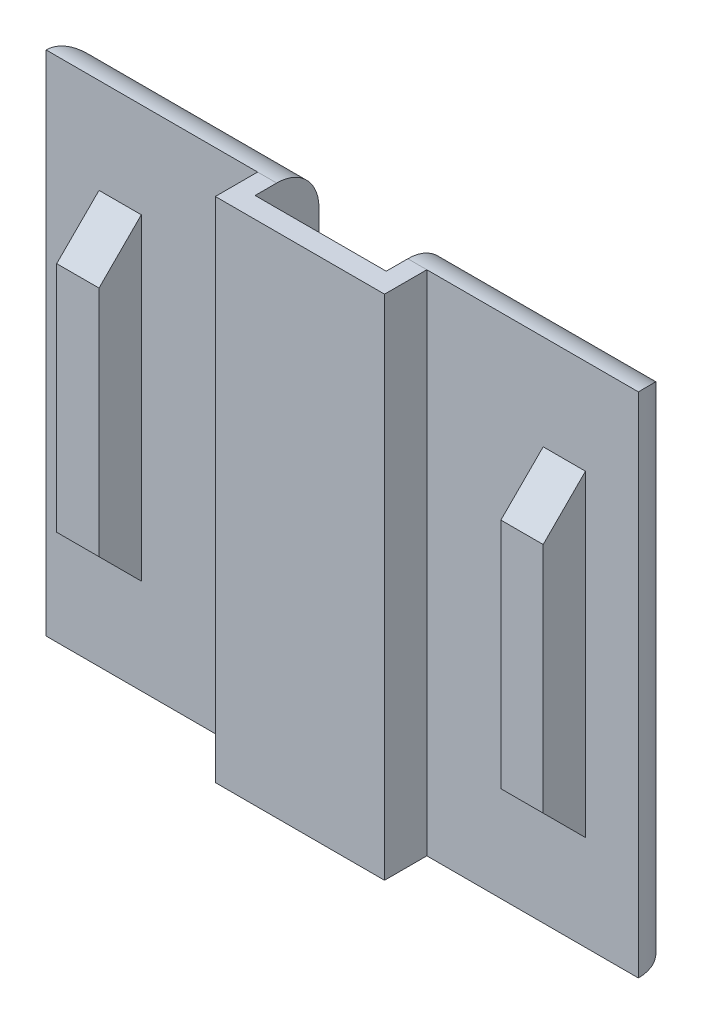
ISO-10303-21;
HEADER;
FILE_DESCRIPTION(('STEP AP214'),'2;1');
FILE_NAME('part.step','',(''),(''),'','','');
FILE_SCHEMA(('AUTOMOTIVE_DESIGN { 1 0 10303 214 1 1 1 1 }'));
ENDSEC;
DATA;
#1=APPLICATION_CONTEXT('core data for automotive mechanical design processes');
#2=APPLICATION_PROTOCOL_DEFINITION('international standard','automotive_design',2000,#1);
#3=PRODUCT_CONTEXT('',#1,'mechanical');
#4=PRODUCT('Part','Part','',(#3));
#5=PRODUCT_RELATED_PRODUCT_CATEGORY('part','',(#4));
#6=PRODUCT_DEFINITION_FORMATION('','',#4);
#7=PRODUCT_DEFINITION_CONTEXT('part definition',#1,'design');
#8=PRODUCT_DEFINITION('design','',#6,#7);
#9=PRODUCT_DEFINITION_SHAPE('','',#8);
#10=(LENGTH_UNIT() NAMED_UNIT(*) SI_UNIT(.MILLI.,.METRE.));
#11=(NAMED_UNIT(*) PLANE_ANGLE_UNIT() SI_UNIT($,.RADIAN.));
#12=(NAMED_UNIT(*) SI_UNIT($,.STERADIAN.) SOLID_ANGLE_UNIT());
#13=UNCERTAINTY_MEASURE_WITH_UNIT(LENGTH_MEASURE(1.E-05),#10,'distance_accuracy_value','');
#14=(GEOMETRIC_REPRESENTATION_CONTEXT(3) GLOBAL_UNCERTAINTY_ASSIGNED_CONTEXT((#13)) GLOBAL_UNIT_ASSIGNED_CONTEXT((#10,
#11,#12)) REPRESENTATION_CONTEXT('',''));
#15=CARTESIAN_POINT('',(0.,0.,0.));
#16=DIRECTION('',(0.,0.,1.));
#17=DIRECTION('',(1.,0.,0.));
#18=AXIS2_PLACEMENT_3D('',#15,#16,#17);
#19=CARTESIAN_POINT('',(0.,0.,1.));
#20=DIRECTION('',(0.,0.,1.));
#21=DIRECTION('',(1.,0.,0.));
#22=AXIS2_PLACEMENT_3D('',#19,#20,#21);
#23=PLANE('',#22);
#24=DIRECTION('',(0.,-1.,0.));
#25=VECTOR('',#24,1.);
#26=CARTESIAN_POINT('',(-5.75,4.75,1.));
#27=LINE('',#26,#25);
#28=CARTESIAN_POINT('',(-5.75,3.75,1.));
#29=VERTEX_POINT('',#28);
#30=CARTESIAN_POINT('',(-5.75,-3.75,1.));
#31=VERTEX_POINT('',#30);
#32=EDGE_CURVE('E296',#29,#31,#27,.T.);
#33=ORIENTED_EDGE('',*,*,#32,.F.);
#34=DIRECTION('',(-1.,0.,0.));
#35=VECTOR('',#34,1.);
#36=CARTESIAN_POINT('',(-5.75,3.75,1.));
#37=LINE('',#36,#35);
#38=CARTESIAN_POINT('',(-4.75,3.75,1.));
#39=VERTEX_POINT('',#38);
#40=EDGE_CURVE('E198',#39,#29,#37,.T.);
#41=ORIENTED_EDGE('',*,*,#40,.F.);
#42=DIRECTION('',(0.,1.,0.));
#43=VECTOR('',#42,1.);
#44=CARTESIAN_POINT('',(-4.75,4.75,1.));
#45=LINE('',#44,#43);
#46=CARTESIAN_POINT('',(-4.75,-3.75,1.));
#47=VERTEX_POINT('',#46);
#48=EDGE_CURVE('E332',#47,#39,#45,.T.);
#49=ORIENTED_EDGE('',*,*,#48,.F.);
#50=DIRECTION('',(1.,0.,0.));
#51=VECTOR('',#50,1.);
#52=CARTESIAN_POINT('',(-5.75,-3.75,1.));
#53=LINE('',#52,#51);
#54=EDGE_CURVE('E300',#31,#47,#53,.T.);
#55=ORIENTED_EDGE('',*,*,#54,.F.);
#56=EDGE_LOOP('',(#33,#41,#49,#55));
#57=FACE_BOUND('',#56,.T.);
#58=DIRECTION('',(0.,-1.,0.));
#59=VECTOR('',#58,1.);
#60=CARTESIAN_POINT('',(-2.,-6.,1.));
#61=LINE('',#60,#59);
#62=CARTESIAN_POINT('',(-2.,6.,1.));
#63=VERTEX_POINT('',#62);
#64=CARTESIAN_POINT('',(-2.,-6.,1.));
#65=VERTEX_POINT('',#64);
#66=EDGE_CURVE('E239',#63,#65,#61,.T.);
#67=ORIENTED_EDGE('',*,*,#66,.F.);
#68=DIRECTION('',(-1.,0.,0.));
#69=VECTOR('',#68,1.);
#70=CARTESIAN_POINT('',(7.,6.,1.));
#71=LINE('',#70,#69);
#72=CARTESIAN_POINT('',(-7.,6.,1.));
#73=VERTEX_POINT('',#72);
#74=EDGE_CURVE('E607',#63,#73,#71,.T.);
#75=ORIENTED_EDGE('',*,*,#74,.T.);
#76=DIRECTION('',(0.,-1.,0.));
#77=VECTOR('',#76,1.);
#78=CARTESIAN_POINT('',(-7.,-6.,1.));
#79=LINE('',#78,#77);
#80=CARTESIAN_POINT('',(-7.,-6.,1.));
#81=VERTEX_POINT('',#80);
#82=EDGE_CURVE('E617',#73,#81,#79,.T.);
#83=ORIENTED_EDGE('',*,*,#82,.T.);
#84=DIRECTION('',(1.,0.,0.));
#85=VECTOR('',#84,1.);
#86=CARTESIAN_POINT('',(7.,-6.,1.));
#87=LINE('',#86,#85);
#88=EDGE_CURVE('E618',#81,#65,#87,.T.);
#89=ORIENTED_EDGE('',*,*,#88,.T.);
#90=EDGE_LOOP('',(#67,#75,#83,#89));
#91=FACE_BOUND('',#90,.T.);
#92=ADVANCED_FACE('F33',(#57,#91),#23,.T.);
#93=DIRECTION('',(-1.,0.,0.));
#94=VECTOR('',#93,1.);
#95=CARTESIAN_POINT('',(4.75,3.75,1.));
#96=LINE('',#95,#94);
#97=CARTESIAN_POINT('',(5.75,3.75,1.));
#98=VERTEX_POINT('',#97);
#99=CARTESIAN_POINT('',(4.75,3.75,1.));
#100=VERTEX_POINT('',#99);
#101=EDGE_CURVE('E179',#98,#100,#96,.T.);
#102=ORIENTED_EDGE('',*,*,#101,.F.);
#103=DIRECTION('',(0.,1.,0.));
#104=VECTOR('',#103,1.);
#105=CARTESIAN_POINT('',(5.75,-4.75,1.));
#106=LINE('',#105,#104);
#107=CARTESIAN_POINT('',(5.75,-3.75,1.));
#108=VERTEX_POINT('',#107);
#109=EDGE_CURVE('E194',#108,#98,#106,.T.);
#110=ORIENTED_EDGE('',*,*,#109,.F.);
#111=DIRECTION('',(1.,0.,0.));
#112=VECTOR('',#111,1.);
#113=CARTESIAN_POINT('',(4.75,-3.75,1.));
#114=LINE('',#113,#112);
#115=CARTESIAN_POINT('',(4.75,-3.75,1.));
#116=VERTEX_POINT('',#115);
#117=EDGE_CURVE('E327',#116,#108,#114,.T.);
#118=ORIENTED_EDGE('',*,*,#117,.F.);
#119=DIRECTION('',(0.,-1.,0.));
#120=VECTOR('',#119,1.);
#121=CARTESIAN_POINT('',(4.75,-4.75,1.));
#122=LINE('',#121,#120);
#123=EDGE_CURVE('E197',#100,#116,#122,.T.);
#124=ORIENTED_EDGE('',*,*,#123,.F.);
#125=EDGE_LOOP('',(#102,#110,#118,#124));
#126=FACE_BOUND('',#125,.T.);
#127=DIRECTION('',(0.,1.,0.));
#128=VECTOR('',#127,1.);
#129=CARTESIAN_POINT('',(2.,-6.,1.));
#130=LINE('',#129,#128);
#131=CARTESIAN_POINT('',(2.,-6.,1.));
#132=VERTEX_POINT('',#131);
#133=CARTESIAN_POINT('',(2.,6.,1.));
#134=VERTEX_POINT('',#133);
#135=EDGE_CURVE('E234',#132,#134,#130,.T.);
#136=ORIENTED_EDGE('',*,*,#135,.F.);
#137=CARTESIAN_POINT('',(7.,-6.,1.));
#138=VERTEX_POINT('',#137);
#139=EDGE_CURVE('E619',#132,#138,#87,.T.);
#140=ORIENTED_EDGE('',*,*,#139,.T.);
#141=DIRECTION('',(0.,1.,0.));
#142=VECTOR('',#141,1.);
#143=CARTESIAN_POINT('',(7.,-6.,1.));
#144=LINE('',#143,#142);
#145=CARTESIAN_POINT('',(7.,6.,1.));
#146=VERTEX_POINT('',#145);
#147=EDGE_CURVE('E610',#138,#146,#144,.T.);
#148=ORIENTED_EDGE('',*,*,#147,.T.);
#149=EDGE_CURVE('E265',#146,#134,#71,.T.);
#150=ORIENTED_EDGE('',*,*,#149,.T.);
#151=EDGE_LOOP('',(#136,#140,#148,#150));
#152=FACE_BOUND('',#151,.T.);
#153=ADVANCED_FACE('F191',(#126,#152),#23,.T.);
#154=CARTESIAN_POINT('',(0.,0.,0.));
#155=DIRECTION('',(0.,0.,1.));
#156=DIRECTION('',(1.,0.,0.));
#157=AXIS2_PLACEMENT_3D('',#154,#155,#156);
#158=PLANE('',#157);
#159=DIRECTION('',(0.,-1.,0.));
#160=VECTOR('',#159,1.);
#161=CARTESIAN_POINT('',(-6.,0.,0.));
#162=LINE('',#161,#160);
#163=CARTESIAN_POINT('',(-6.,-6.,0.));
#164=VERTEX_POINT('',#163);
#165=CARTESIAN_POINT('',(-6.,5.,0.));
#166=VERTEX_POINT('',#165);
#167=EDGE_CURVE('E275',#164,#166,#162,.F.);
#168=ORIENTED_EDGE('',*,*,#167,.T.);
#169=DIRECTION('',(-1.,0.,0.));
#170=VECTOR('',#169,1.);
#171=CARTESIAN_POINT('',(0.,5.,0.));
#172=LINE('',#171,#170);
#173=CARTESIAN_POINT('',(-1.55,5.,0.));
#174=VERTEX_POINT('',#173);
#175=EDGE_CURVE('E279',#166,#174,#172,.F.);
#176=ORIENTED_EDGE('',*,*,#175,.T.);
#177=DIRECTION('',(0.,-1.,0.));
#178=VECTOR('',#177,1.);
#179=CARTESIAN_POINT('',(-1.55,0.,0.));
#180=LINE('',#179,#178);
#181=CARTESIAN_POINT('',(-1.55,-6.,0.));
#182=VERTEX_POINT('',#181);
#183=EDGE_CURVE('E264',#174,#182,#180,.T.);
#184=ORIENTED_EDGE('',*,*,#183,.T.);
#185=DIRECTION('',(1.,0.,0.));
#186=VECTOR('',#185,1.);
#187=CARTESIAN_POINT('',(7.,-6.,0.));
#188=LINE('',#187,#186);
#189=EDGE_CURVE('E594',#164,#182,#188,.T.);
#190=ORIENTED_EDGE('',*,*,#189,.F.);
#191=EDGE_LOOP('',(#168,#176,#184,#190));
#192=FACE_BOUND('',#191,.T.);
#193=ADVANCED_FACE('F359',(#192),#158,.F.);
#194=CARTESIAN_POINT('',(7.,-6.,1.));
#195=DIRECTION('',(0.,1.,0.));
#196=DIRECTION('',(-1.,0.,0.));
#197=AXIS2_PLACEMENT_3D('',#194,#195,#196);
#198=PLANE('',#197);
#199=CARTESIAN_POINT('',(1.55,-6.,0.));
#200=VERTEX_POINT('',#199);
#201=CARTESIAN_POINT('',(6.,-6.,0.));
#202=VERTEX_POINT('',#201);
#203=EDGE_CURVE('E591',#200,#202,#188,.T.);
#204=ORIENTED_EDGE('',*,*,#203,.T.);
#205=CARTESIAN_POINT('',(6.,-6.,1.));
#206=DIRECTION('',(0.,1.,0.));
#207=DIRECTION('',(-1.,0.,0.));
#208=AXIS2_PLACEMENT_3D('',#205,#206,#207);
#209=CIRCLE('',#208,1.);
#210=EDGE_CURVE('E291',#202,#138,#209,.F.);
#211=ORIENTED_EDGE('',*,*,#210,.T.);
#212=ORIENTED_EDGE('',*,*,#139,.F.);
#213=DIRECTION('',(0.,0.,-1.));
#214=VECTOR('',#213,1.);
#215=CARTESIAN_POINT('',(2.,-6.,2.));
#216=LINE('',#215,#214);
#217=CARTESIAN_POINT('',(2.,-6.,2.));
#218=VERTEX_POINT('',#217);
#219=EDGE_CURVE('E245',#218,#132,#216,.T.);
#220=ORIENTED_EDGE('',*,*,#219,.F.);
#221=DIRECTION('',(1.,0.,0.));
#222=VECTOR('',#221,1.);
#223=CARTESIAN_POINT('',(-2.,-6.,2.));
#224=LINE('',#223,#222);
#225=CARTESIAN_POINT('',(-2.,-6.,2.));
#226=VERTEX_POINT('',#225);
#227=EDGE_CURVE('E243',#226,#218,#224,.T.);
#228=ORIENTED_EDGE('',*,*,#227,.F.);
#229=DIRECTION('',(0.,0.,-1.));
#230=VECTOR('',#229,1.);
#231=CARTESIAN_POINT('',(-2.,-6.,2.));
#232=LINE('',#231,#230);
#233=EDGE_CURVE('E258',#226,#65,#232,.T.);
#234=ORIENTED_EDGE('',*,*,#233,.T.);
#235=ORIENTED_EDGE('',*,*,#88,.F.);
#236=CARTESIAN_POINT('',(-6.,-6.,1.));
#237=DIRECTION('',(0.,1.,0.));
#238=DIRECTION('',(-1.,0.,0.));
#239=AXIS2_PLACEMENT_3D('',#236,#237,#238);
#240=CIRCLE('',#239,1.);
#241=EDGE_CURVE('E289',#81,#164,#240,.F.);
#242=ORIENTED_EDGE('',*,*,#241,.T.);
#243=ORIENTED_EDGE('',*,*,#189,.T.);
#244=DIRECTION('',(0.,0.,1.));
#245=VECTOR('',#244,1.);
#246=CARTESIAN_POINT('',(-1.55,-6.,1.));
#247=LINE('',#246,#245);
#248=CARTESIAN_POINT('',(-1.55,-6.,1.51));
#249=VERTEX_POINT('',#248);
#250=EDGE_CURVE('E228',#182,#249,#247,.T.);
#251=ORIENTED_EDGE('',*,*,#250,.T.);
#252=DIRECTION('',(1.,0.,0.));
#253=VECTOR('',#252,1.);
#254=CARTESIAN_POINT('',(7.,-6.,1.51));
#255=LINE('',#254,#253);
#256=CARTESIAN_POINT('',(1.55,-6.,1.51));
#257=VERTEX_POINT('',#256);
#258=EDGE_CURVE('E231',#249,#257,#255,.T.);
#259=ORIENTED_EDGE('',*,*,#258,.T.);
#260=DIRECTION('',(0.,0.,-1.));
#261=VECTOR('',#260,1.);
#262=CARTESIAN_POINT('',(1.55,-6.,1.));
#263=LINE('',#262,#261);
#264=EDGE_CURVE('E223',#257,#200,#263,.T.);
#265=ORIENTED_EDGE('',*,*,#264,.T.);
#266=EDGE_LOOP('',(#204,#211,#212,#220,#228,#234,#235,#242,#243,#251,#259,#265));
#267=FACE_BOUND('',#266,.T.);
#268=ADVANCED_FACE('F372',(#267),#198,.F.);
#269=CARTESIAN_POINT('',(7.,6.,1.));
#270=DIRECTION('',(0.,-1.,0.));
#271=DIRECTION('',(1.,0.,0.));
#272=AXIS2_PLACEMENT_3D('',#269,#270,#271);
#273=PLANE('',#272);
#274=DIRECTION('',(0.,0.,1.));
#275=VECTOR('',#274,1.);
#276=CARTESIAN_POINT('',(-1.55,6.,0.));
#277=LINE('',#276,#275);
#278=CARTESIAN_POINT('',(-1.55,6.,1.));
#279=VERTEX_POINT('',#278);
#280=CARTESIAN_POINT('',(-1.55,6.,1.51));
#281=VERTEX_POINT('',#280);
#282=EDGE_CURVE('E212',#279,#281,#277,.T.);
#283=ORIENTED_EDGE('',*,*,#282,.F.);
#284=DIRECTION('',(-1.,0.,0.));
#285=VECTOR('',#284,1.);
#286=CARTESIAN_POINT('',(7.,6.,1.));
#287=LINE('',#286,#285);
#288=EDGE_CURVE('E270',#279,#63,#287,.T.);
#289=ORIENTED_EDGE('',*,*,#288,.T.);
#290=DIRECTION('',(0.,0.,-1.));
#291=VECTOR('',#290,1.);
#292=CARTESIAN_POINT('',(-2.,6.,2.));
#293=LINE('',#292,#291);
#294=CARTESIAN_POINT('',(-2.,6.,2.));
#295=VERTEX_POINT('',#294);
#296=EDGE_CURVE('E592',#295,#63,#293,.T.);
#297=ORIENTED_EDGE('',*,*,#296,.F.);
#298=DIRECTION('',(-1.,0.,0.));
#299=VECTOR('',#298,1.);
#300=CARTESIAN_POINT('',(-2.,6.,2.));
#301=LINE('',#300,#299);
#302=CARTESIAN_POINT('',(2.,6.,2.));
#303=VERTEX_POINT('',#302);
#304=EDGE_CURVE('E238',#303,#295,#301,.T.);
#305=ORIENTED_EDGE('',*,*,#304,.F.);
#306=DIRECTION('',(0.,0.,-1.));
#307=VECTOR('',#306,1.);
#308=CARTESIAN_POINT('',(2.,6.,2.));
#309=LINE('',#308,#307);
#310=EDGE_CURVE('E590',#303,#134,#309,.T.);
#311=ORIENTED_EDGE('',*,*,#310,.T.);
#312=DIRECTION('',(-1.,0.,0.));
#313=VECTOR('',#312,1.);
#314=CARTESIAN_POINT('',(7.,6.,1.));
#315=LINE('',#314,#313);
#316=CARTESIAN_POINT('',(1.55,6.,1.));
#317=VERTEX_POINT('',#316);
#318=EDGE_CURVE('E268',#134,#317,#315,.T.);
#319=ORIENTED_EDGE('',*,*,#318,.T.);
#320=DIRECTION('',(0.,0.,-1.));
#321=VECTOR('',#320,1.);
#322=CARTESIAN_POINT('',(1.55,6.,0.));
#323=LINE('',#322,#321);
#324=CARTESIAN_POINT('',(1.55,6.,1.51));
#325=VERTEX_POINT('',#324);
#326=EDGE_CURVE('E217',#325,#317,#323,.T.);
#327=ORIENTED_EDGE('',*,*,#326,.F.);
#328=DIRECTION('',(1.,0.,0.));
#329=VECTOR('',#328,1.);
#330=CARTESIAN_POINT('',(-1.55,6.,1.51));
#331=LINE('',#330,#329);
#332=EDGE_CURVE('E214',#281,#325,#331,.T.);
#333=ORIENTED_EDGE('',*,*,#332,.F.);
#334=EDGE_LOOP('',(#283,#289,#297,#305,#311,#319,#327,#333));
#335=FACE_BOUND('',#334,.T.);
#336=ADVANCED_FACE('F368',(#335),#273,.F.);
#337=DIRECTION('',(0.,1.,0.));
#338=VECTOR('',#337,1.);
#339=CARTESIAN_POINT('',(1.55,0.,0.));
#340=LINE('',#339,#338);
#341=CARTESIAN_POINT('',(1.55,5.,0.));
#342=VERTEX_POINT('',#341);
#343=EDGE_CURVE('E261',#200,#342,#340,.T.);
#344=ORIENTED_EDGE('',*,*,#343,.T.);
#345=DIRECTION('',(-1.,0.,0.));
#346=VECTOR('',#345,1.);
#347=CARTESIAN_POINT('',(0.,5.,0.));
#348=LINE('',#347,#346);
#349=CARTESIAN_POINT('',(6.,5.,0.));
#350=VERTEX_POINT('',#349);
#351=EDGE_CURVE('E287',#342,#350,#348,.F.);
#352=ORIENTED_EDGE('',*,*,#351,.T.);
#353=DIRECTION('',(0.,1.,0.));
#354=VECTOR('',#353,1.);
#355=CARTESIAN_POINT('',(6.,0.,0.));
#356=LINE('',#355,#354);
#357=EDGE_CURVE('E285',#350,#202,#356,.F.);
#358=ORIENTED_EDGE('',*,*,#357,.T.);
#359=ORIENTED_EDGE('',*,*,#203,.F.);
#360=EDGE_LOOP('',(#344,#352,#358,#359));
#361=FACE_BOUND('',#360,.T.);
#362=ADVANCED_FACE('F365',(#361),#158,.F.);
#363=CARTESIAN_POINT('',(2.,-6.,2.));
#364=DIRECTION('',(-1.,0.,0.));
#365=DIRECTION('',(0.,0.,1.));
#366=AXIS2_PLACEMENT_3D('',#363,#364,#365);
#367=PLANE('',#366);
#368=ORIENTED_EDGE('',*,*,#135,.T.);
#369=ORIENTED_EDGE('',*,*,#310,.F.);
#370=DIRECTION('',(0.,1.,0.));
#371=VECTOR('',#370,1.);
#372=CARTESIAN_POINT('',(2.,-6.,2.));
#373=LINE('',#372,#371);
#374=EDGE_CURVE('E235',#218,#303,#373,.T.);
#375=ORIENTED_EDGE('',*,*,#374,.F.);
#376=ORIENTED_EDGE('',*,*,#219,.T.);
#377=EDGE_LOOP('',(#368,#369,#375,#376));
#378=FACE_BOUND('',#377,.T.);
#379=ADVANCED_FACE('F363',(#378),#367,.F.);
#380=CARTESIAN_POINT('',(-2.,-6.,2.));
#381=DIRECTION('',(1.,0.,0.));
#382=DIRECTION('',(0.,0.,-1.));
#383=AXIS2_PLACEMENT_3D('',#380,#381,#382);
#384=PLANE('',#383);
#385=ORIENTED_EDGE('',*,*,#66,.T.);
#386=ORIENTED_EDGE('',*,*,#233,.F.);
#387=DIRECTION('',(0.,-1.,0.));
#388=VECTOR('',#387,1.);
#389=CARTESIAN_POINT('',(-2.,-6.,2.));
#390=LINE('',#389,#388);
#391=EDGE_CURVE('E241',#295,#226,#390,.T.);
#392=ORIENTED_EDGE('',*,*,#391,.F.);
#393=ORIENTED_EDGE('',*,*,#296,.T.);
#394=EDGE_LOOP('',(#385,#386,#392,#393));
#395=FACE_BOUND('',#394,.T.);
#396=ADVANCED_FACE('F524',(#395),#384,.F.);
#397=CARTESIAN_POINT('',(0.,0.,2.));
#398=DIRECTION('',(0.,0.,-1.));
#399=DIRECTION('',(-1.,0.,0.));
#400=AXIS2_PLACEMENT_3D('',#397,#398,#399);
#401=PLANE('',#400);
#402=ORIENTED_EDGE('',*,*,#374,.T.);
#403=ORIENTED_EDGE('',*,*,#304,.T.);
#404=ORIENTED_EDGE('',*,*,#391,.T.);
#405=ORIENTED_EDGE('',*,*,#227,.T.);
#406=EDGE_LOOP('',(#402,#403,#404,#405));
#407=FACE_BOUND('',#406,.T.);
#408=ADVANCED_FACE('F529',(#407),#401,.F.);
#409=CARTESIAN_POINT('',(-1.55,-6.00005,1.51));
#410=DIRECTION('',(0.,0.,1.));
#411=DIRECTION('',(1.,0.,0.));
#412=AXIS2_PLACEMENT_3D('',#409,#410,#411);
#413=PLANE('',#412);
#414=DIRECTION('',(0.,1.,0.));
#415=VECTOR('',#414,1.);
#416=CARTESIAN_POINT('',(-1.55,-6.00005,1.51));
#417=LINE('',#416,#415);
#418=EDGE_CURVE('E220',#249,#281,#417,.T.);
#419=ORIENTED_EDGE('',*,*,#418,.T.);
#420=ORIENTED_EDGE('',*,*,#332,.T.);
#421=DIRECTION('',(0.,1.,0.));
#422=VECTOR('',#421,1.);
#423=CARTESIAN_POINT('',(1.55,-6.00005,1.51));
#424=LINE('',#423,#422);
#425=EDGE_CURVE('E221',#257,#325,#424,.T.);
#426=ORIENTED_EDGE('',*,*,#425,.F.);
#427=ORIENTED_EDGE('',*,*,#258,.F.);
#428=EDGE_LOOP('',(#419,#420,#426,#427));
#429=FACE_BOUND('',#428,.T.);
#430=ADVANCED_FACE('F516',(#429),#413,.F.);
#431=CARTESIAN_POINT('',(-1.55,-6.00005,0.));
#432=DIRECTION('',(-1.,0.,0.));
#433=DIRECTION('',(0.,-1.,0.));
#434=AXIS2_PLACEMENT_3D('',#431,#432,#433);
#435=PLANE('',#434);
#436=ORIENTED_EDGE('',*,*,#183,.F.);
#437=CARTESIAN_POINT('',(-1.55,5.,1.));
#438=DIRECTION('',(-1.,0.,0.));
#439=DIRECTION('',(0.,-1.,0.));
#440=AXIS2_PLACEMENT_3D('',#437,#438,#439);
#441=CIRCLE('',#440,1.);
#442=EDGE_CURVE('E281',#174,#279,#441,.F.);
#443=ORIENTED_EDGE('',*,*,#442,.T.);
#444=ORIENTED_EDGE('',*,*,#282,.T.);
#445=ORIENTED_EDGE('',*,*,#418,.F.);
#446=ORIENTED_EDGE('',*,*,#250,.F.);
#447=EDGE_LOOP('',(#436,#443,#444,#445,#446));
#448=FACE_BOUND('',#447,.T.);
#449=ADVANCED_FACE('F506',(#448),#435,.F.);
#450=CARTESIAN_POINT('',(1.55,-6.00005,0.));
#451=DIRECTION('',(1.,0.,0.));
#452=DIRECTION('',(0.,1.,0.));
#453=AXIS2_PLACEMENT_3D('',#450,#451,#452);
#454=PLANE('',#453);
#455=ORIENTED_EDGE('',*,*,#326,.T.);
#456=CARTESIAN_POINT('',(1.55,5.,1.));
#457=DIRECTION('',(1.,0.,0.));
#458=DIRECTION('',(0.,1.,0.));
#459=AXIS2_PLACEMENT_3D('',#456,#457,#458);
#460=CIRCLE('',#459,1.);
#461=EDGE_CURVE('E283',#317,#342,#460,.F.);
#462=ORIENTED_EDGE('',*,*,#461,.T.);
#463=ORIENTED_EDGE('',*,*,#343,.F.);
#464=ORIENTED_EDGE('',*,*,#264,.F.);
#465=ORIENTED_EDGE('',*,*,#425,.T.);
#466=EDGE_LOOP('',(#455,#462,#463,#464,#465));
#467=FACE_BOUND('',#466,.T.);
#468=ADVANCED_FACE('F352',(#467),#454,.F.);
#469=CARTESIAN_POINT('',(5.75,-4.75,2.));
#470=DIRECTION('',(-1.,0.,0.));
#471=DIRECTION('',(0.,0.,1.));
#472=AXIS2_PLACEMENT_3D('',#469,#470,#471);
#473=PLANE('',#472);
#474=ORIENTED_EDGE('',*,*,#109,.T.);
#475=DIRECTION('',(0.,-0.707106781186549,0.707106781186546));
#476=VECTOR('',#475,1.);
#477=CARTESIAN_POINT('',(5.75,3.75,1.));
#478=LINE('',#477,#476);
#479=CARTESIAN_POINT('',(5.75,2.75,2.));
#480=VERTEX_POINT('',#479);
#481=EDGE_CURVE('E175',#98,#480,#478,.T.);
#482=ORIENTED_EDGE('',*,*,#481,.T.);
#483=DIRECTION('',(0.,1.,0.));
#484=VECTOR('',#483,1.);
#485=CARTESIAN_POINT('',(5.75,-4.75,2.));
#486=LINE('',#485,#484);
#487=CARTESIAN_POINT('',(5.75,-2.75,2.));
#488=VERTEX_POINT('',#487);
#489=EDGE_CURVE('E204',#488,#480,#486,.T.);
#490=ORIENTED_EDGE('',*,*,#489,.F.);
#491=DIRECTION('',(0.,-0.707106781186549,-0.707106781186546));
#492=VECTOR('',#491,1.);
#493=CARTESIAN_POINT('',(5.75,-3.75,1.));
#494=LINE('',#493,#492);
#495=EDGE_CURVE('E186',#488,#108,#494,.T.);
#496=ORIENTED_EDGE('',*,*,#495,.T.);
#497=EDGE_LOOP('',(#474,#482,#490,#496));
#498=FACE_BOUND('',#497,.T.);
#499=ADVANCED_FACE('F200',(#498),#473,.F.);
#500=CARTESIAN_POINT('',(4.75,-4.75,2.));
#501=DIRECTION('',(1.,0.,0.));
#502=DIRECTION('',(0.,0.,-1.));
#503=AXIS2_PLACEMENT_3D('',#500,#501,#502);
#504=PLANE('',#503);
#505=DIRECTION('',(0.,-1.,0.));
#506=VECTOR('',#505,1.);
#507=CARTESIAN_POINT('',(4.75,-4.75,2.));
#508=LINE('',#507,#506);
#509=CARTESIAN_POINT('',(4.75,2.75,2.));
#510=VERTEX_POINT('',#509);
#511=CARTESIAN_POINT('',(4.75,-2.75,2.));
#512=VERTEX_POINT('',#511);
#513=EDGE_CURVE('E209',#510,#512,#508,.T.);
#514=ORIENTED_EDGE('',*,*,#513,.F.);
#515=DIRECTION('',(0.,0.707106781186549,-0.707106781186546));
#516=VECTOR('',#515,1.);
#517=CARTESIAN_POINT('',(4.75,3.75,1.));
#518=LINE('',#517,#516);
#519=EDGE_CURVE('E306',#510,#100,#518,.T.);
#520=ORIENTED_EDGE('',*,*,#519,.T.);
#521=ORIENTED_EDGE('',*,*,#123,.T.);
#522=DIRECTION('',(0.,0.707106781186549,0.707106781186546));
#523=VECTOR('',#522,1.);
#524=CARTESIAN_POINT('',(4.75,-3.75,1.));
#525=LINE('',#524,#523);
#526=EDGE_CURVE('E304',#116,#512,#525,.T.);
#527=ORIENTED_EDGE('',*,*,#526,.T.);
#528=EDGE_LOOP('',(#514,#520,#521,#527));
#529=FACE_BOUND('',#528,.T.);
#530=ADVANCED_FACE('F343',(#529),#504,.F.);
#531=CARTESIAN_POINT('',(0.,0.,2.));
#532=DIRECTION('',(0.,0.,1.));
#533=DIRECTION('',(1.,0.,0.));
#534=AXIS2_PLACEMENT_3D('',#531,#532,#533);
#535=PLANE('',#534);
#536=ORIENTED_EDGE('',*,*,#489,.T.);
#537=DIRECTION('',(-1.,0.,0.));
#538=VECTOR('',#537,1.);
#539=CARTESIAN_POINT('',(4.75,2.75,2.));
#540=LINE('',#539,#538);
#541=EDGE_CURVE('E180',#480,#510,#540,.T.);
#542=ORIENTED_EDGE('',*,*,#541,.T.);
#543=ORIENTED_EDGE('',*,*,#513,.T.);
#544=DIRECTION('',(1.,0.,0.));
#545=VECTOR('',#544,1.);
#546=CARTESIAN_POINT('',(5.75,-2.75,2.));
#547=LINE('',#546,#545);
#548=EDGE_CURVE('E185',#512,#488,#547,.T.);
#549=ORIENTED_EDGE('',*,*,#548,.T.);
#550=EDGE_LOOP('',(#536,#542,#543,#549));
#551=FACE_BOUND('',#550,.T.);
#552=ADVANCED_FACE('F339',(#551),#535,.T.);
#553=CARTESIAN_POINT('',(-5.75,4.75,2.));
#554=DIRECTION('',(1.,0.,0.));
#555=DIRECTION('',(0.,1.,0.));
#556=AXIS2_PLACEMENT_3D('',#553,#554,#555);
#557=PLANE('',#556);
#558=DIRECTION('',(0.,-1.,0.));
#559=VECTOR('',#558,1.);
#560=CARTESIAN_POINT('',(-5.75,4.75,2.));
#561=LINE('',#560,#559);
#562=CARTESIAN_POINT('',(-5.75,2.75,2.));
#563=VERTEX_POINT('',#562);
#564=CARTESIAN_POINT('',(-5.75,-2.75,2.));
#565=VERTEX_POINT('',#564);
#566=EDGE_CURVE('E206',#563,#565,#561,.T.);
#567=ORIENTED_EDGE('',*,*,#566,.F.);
#568=DIRECTION('',(0.,0.707106781186549,-0.707106781186546));
#569=VECTOR('',#568,1.);
#570=CARTESIAN_POINT('',(-5.75,3.75,1.));
#571=LINE('',#570,#569);
#572=EDGE_CURVE('E11',#563,#29,#571,.T.);
#573=ORIENTED_EDGE('',*,*,#572,.T.);
#574=ORIENTED_EDGE('',*,*,#32,.T.);
#575=DIRECTION('',(0.,0.707106781186549,0.707106781186546));
#576=VECTOR('',#575,1.);
#577=CARTESIAN_POINT('',(-5.75,-3.75,1.));
#578=LINE('',#577,#576);
#579=EDGE_CURVE('E41',#31,#565,#578,.T.);
#580=ORIENTED_EDGE('',*,*,#579,.T.);
#581=EDGE_LOOP('',(#567,#573,#574,#580));
#582=FACE_BOUND('',#581,.T.);
#583=ADVANCED_FACE('F350',(#582),#557,.F.);
#584=CARTESIAN_POINT('',(-4.75,4.75,2.));
#585=DIRECTION('',(-1.,0.,0.));
#586=DIRECTION('',(0.,-1.,0.));
#587=AXIS2_PLACEMENT_3D('',#584,#585,#586);
#588=PLANE('',#587);
#589=ORIENTED_EDGE('',*,*,#48,.T.);
#590=DIRECTION('',(0.,-0.707106781186549,0.707106781186546));
#591=VECTOR('',#590,1.);
#592=CARTESIAN_POINT('',(-4.75,3.75,1.));
#593=LINE('',#592,#591);
#594=CARTESIAN_POINT('',(-4.75,2.75,2.));
#595=VERTEX_POINT('',#594);
#596=EDGE_CURVE('E310',#39,#595,#593,.T.);
#597=ORIENTED_EDGE('',*,*,#596,.T.);
#598=DIRECTION('',(0.,1.,0.));
#599=VECTOR('',#598,1.);
#600=CARTESIAN_POINT('',(-4.75,4.75,2.));
#601=LINE('',#600,#599);
#602=CARTESIAN_POINT('',(-4.75,-2.75,2.));
#603=VERTEX_POINT('',#602);
#604=EDGE_CURVE('E202',#603,#595,#601,.T.);
#605=ORIENTED_EDGE('',*,*,#604,.F.);
#606=DIRECTION('',(0.,-0.707106781186549,-0.707106781186546));
#607=VECTOR('',#606,1.);
#608=CARTESIAN_POINT('',(-4.75,-3.75,1.));
#609=LINE('',#608,#607);
#610=EDGE_CURVE('E308',#603,#47,#609,.T.);
#611=ORIENTED_EDGE('',*,*,#610,.T.);
#612=EDGE_LOOP('',(#589,#597,#605,#611));
#613=FACE_BOUND('',#612,.T.);
#614=ADVANCED_FACE('F321',(#613),#588,.F.);
#615=CARTESIAN_POINT('',(0.,0.,2.));
#616=DIRECTION('',(0.,0.,1.));
#617=DIRECTION('',(1.,0.,0.));
#618=AXIS2_PLACEMENT_3D('',#615,#616,#617);
#619=PLANE('',#618);
#620=ORIENTED_EDGE('',*,*,#604,.T.);
#621=DIRECTION('',(-1.,0.,0.));
#622=VECTOR('',#621,1.);
#623=CARTESIAN_POINT('',(-5.75,2.75,2.));
#624=LINE('',#623,#622);
#625=EDGE_CURVE('E54',#595,#563,#624,.T.);
#626=ORIENTED_EDGE('',*,*,#625,.T.);
#627=ORIENTED_EDGE('',*,*,#566,.T.);
#628=DIRECTION('',(1.,0.,0.));
#629=VECTOR('',#628,1.);
#630=CARTESIAN_POINT('',(-4.75,-2.75,2.));
#631=LINE('',#630,#629);
#632=EDGE_CURVE('E312',#565,#603,#631,.T.);
#633=ORIENTED_EDGE('',*,*,#632,.T.);
#634=EDGE_LOOP('',(#620,#626,#627,#633));
#635=FACE_BOUND('',#634,.T.);
#636=ADVANCED_FACE('F316',(#635),#619,.T.);
#637=CARTESIAN_POINT('',(-6.,-6.,1.));
#638=DIRECTION('',(0.,-1.,0.));
#639=DIRECTION('',(0.,0.,-1.));
#640=AXIS2_PLACEMENT_3D('',#637,#638,#639);
#641=CYLINDRICAL_SURFACE('',#640,1.);
#642=ORIENTED_EDGE('',*,*,#241,.F.);
#643=ORIENTED_EDGE('',*,*,#82,.F.);
#644=CARTESIAN_POINT('',(-6.,5.,1.));
#645=DIRECTION('',(-0.707106781186547,-0.707106781186548,0.));
#646=DIRECTION('',(0.707106781186548,-0.707106781186547,0.));
#647=AXIS2_PLACEMENT_3D('',#644,#645,#646);
#648=ELLIPSE('',#647,1.41421356237309,1.);
#649=EDGE_CURVE('E293',#166,#73,#648,.F.);
#650=ORIENTED_EDGE('',*,*,#649,.F.);
#651=ORIENTED_EDGE('',*,*,#167,.F.);
#652=EDGE_LOOP('',(#642,#643,#650,#651));
#653=FACE_BOUND('',#652,.T.);
#654=ADVANCED_FACE('F381',(#653),#641,.T.);
#655=CARTESIAN_POINT('',(7.,5.,1.));
#656=DIRECTION('',(-1.,0.,0.));
#657=DIRECTION('',(0.,-1.,0.));
#658=AXIS2_PLACEMENT_3D('',#655,#656,#657);
#659=CYLINDRICAL_SURFACE('',#658,1.);
#660=ORIENTED_EDGE('',*,*,#442,.F.);
#661=ORIENTED_EDGE('',*,*,#175,.F.);
#662=ORIENTED_EDGE('',*,*,#649,.T.);
#663=ORIENTED_EDGE('',*,*,#74,.F.);
#664=ORIENTED_EDGE('',*,*,#288,.F.);
#665=EDGE_LOOP('',(#660,#661,#662,#663,#664));
#666=FACE_BOUND('',#665,.T.);
#667=ADVANCED_FACE('F377',(#666),#659,.T.);
#668=CARTESIAN_POINT('',(6.,-6.,1.));
#669=DIRECTION('',(0.,1.,0.));
#670=DIRECTION('',(0.,0.,1.));
#671=AXIS2_PLACEMENT_3D('',#668,#669,#670);
#672=CYLINDRICAL_SURFACE('',#671,1.);
#673=ORIENTED_EDGE('',*,*,#210,.F.);
#674=ORIENTED_EDGE('',*,*,#357,.F.);
#675=CARTESIAN_POINT('',(6.,5.,1.));
#676=DIRECTION('',(-0.707106781186548,0.707106781186547,0.));
#677=DIRECTION('',(0.707106781186547,0.707106781186548,0.));
#678=AXIS2_PLACEMENT_3D('',#675,#676,#677);
#679=ELLIPSE('',#678,1.4142135623731,1.);
#680=EDGE_CURVE('E297',#146,#350,#679,.T.);
#681=ORIENTED_EDGE('',*,*,#680,.F.);
#682=ORIENTED_EDGE('',*,*,#147,.F.);
#683=EDGE_LOOP('',(#673,#674,#681,#682));
#684=FACE_BOUND('',#683,.T.);
#685=ADVANCED_FACE('F380',(#684),#672,.T.);
#686=CARTESIAN_POINT('',(7.,5.,1.));
#687=DIRECTION('',(-1.,0.,0.));
#688=DIRECTION('',(0.,-1.,0.));
#689=AXIS2_PLACEMENT_3D('',#686,#687,#688);
#690=CYLINDRICAL_SURFACE('',#689,1.);
#691=ORIENTED_EDGE('',*,*,#680,.T.);
#692=ORIENTED_EDGE('',*,*,#351,.F.);
#693=ORIENTED_EDGE('',*,*,#461,.F.);
#694=ORIENTED_EDGE('',*,*,#318,.F.);
#695=ORIENTED_EDGE('',*,*,#149,.F.);
#696=EDGE_LOOP('',(#691,#692,#693,#694,#695));
#697=FACE_BOUND('',#696,.T.);
#698=ADVANCED_FACE('F386',(#697),#690,.T.);
#699=CARTESIAN_POINT('',(4.75,3.75,1.));
#700=DIRECTION('',(0.,0.707106781186546,0.707106781186549));
#701=DIRECTION('',(-1.,0.,0.));
#702=AXIS2_PLACEMENT_3D('',#699,#700,#701);
#703=PLANE('',#702);
#704=ORIENTED_EDGE('',*,*,#519,.F.);
#705=ORIENTED_EDGE('',*,*,#541,.F.);
#706=ORIENTED_EDGE('',*,*,#481,.F.);
#707=ORIENTED_EDGE('',*,*,#101,.T.);
#708=EDGE_LOOP('',(#704,#705,#706,#707));
#709=FACE_BOUND('',#708,.T.);
#710=ADVANCED_FACE('F178',(#709),#703,.T.);
#711=CARTESIAN_POINT('',(-5.75,3.75,1.));
#712=DIRECTION('',(0.,0.707106781186546,0.707106781186549));
#713=DIRECTION('',(-1.,0.,0.));
#714=AXIS2_PLACEMENT_3D('',#711,#712,#713);
#715=PLANE('',#714);
#716=ORIENTED_EDGE('',*,*,#572,.F.);
#717=ORIENTED_EDGE('',*,*,#625,.F.);
#718=ORIENTED_EDGE('',*,*,#596,.F.);
#719=ORIENTED_EDGE('',*,*,#40,.T.);
#720=EDGE_LOOP('',(#716,#717,#718,#719));
#721=FACE_BOUND('',#720,.T.);
#722=ADVANCED_FACE('F395',(#721),#715,.T.);
#723=CARTESIAN_POINT('',(4.75,-3.75,1.));
#724=DIRECTION('',(0.,-0.707106781186546,0.707106781186549));
#725=DIRECTION('',(1.,0.,0.));
#726=AXIS2_PLACEMENT_3D('',#723,#724,#725);
#727=PLANE('',#726);
#728=ORIENTED_EDGE('',*,*,#495,.F.);
#729=ORIENTED_EDGE('',*,*,#548,.F.);
#730=ORIENTED_EDGE('',*,*,#526,.F.);
#731=ORIENTED_EDGE('',*,*,#117,.T.);
#732=EDGE_LOOP('',(#728,#729,#730,#731));
#733=FACE_BOUND('',#732,.T.);
#734=ADVANCED_FACE('F342',(#733),#727,.T.);
#735=CARTESIAN_POINT('',(-5.75,-3.75,1.));
#736=DIRECTION('',(0.,-0.707106781186546,0.707106781186549));
#737=DIRECTION('',(1.,0.,0.));
#738=AXIS2_PLACEMENT_3D('',#735,#736,#737);
#739=PLANE('',#738);
#740=ORIENTED_EDGE('',*,*,#610,.F.);
#741=ORIENTED_EDGE('',*,*,#632,.F.);
#742=ORIENTED_EDGE('',*,*,#579,.F.);
#743=ORIENTED_EDGE('',*,*,#54,.T.);
#744=EDGE_LOOP('',(#740,#741,#742,#743));
#745=FACE_BOUND('',#744,.T.);
#746=ADVANCED_FACE('F35',(#745),#739,.T.);
#747=CLOSED_SHELL('',(#92,#153,#193,#268,#336,#362,#379,#396,#408,#430,#449,#468,#499,#530,#552,
#583,#614,#636,#654,#667,#685,#698,#710,#722,#734,#746));
#748=MANIFOLD_SOLID_BREP('B2',#747);
#749=ADVANCED_BREP_SHAPE_REPRESENTATION('',(#18,#748),#14);
#750=SHAPE_DEFINITION_REPRESENTATION(#9,#749);
ENDSEC;
END-ISO-10303-21;
